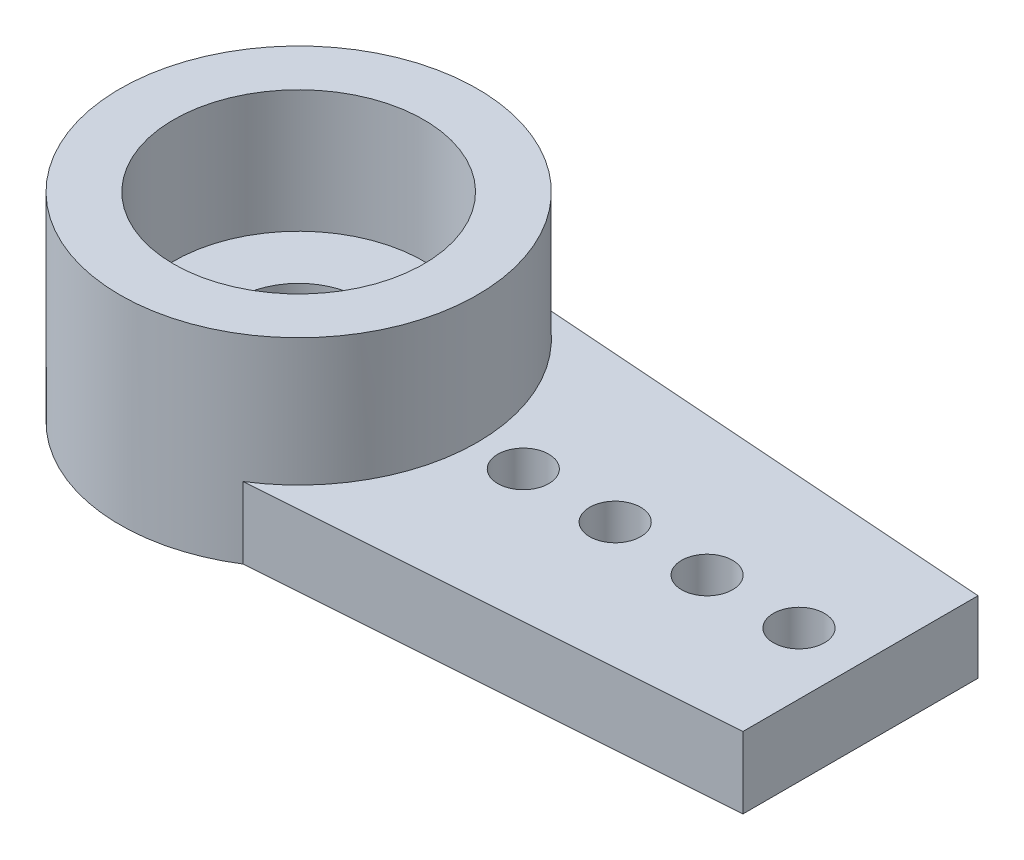
ISO-10303-21;
HEADER;
FILE_DESCRIPTION(('STEP AP214'),'2;1');
FILE_NAME('part.step','',(''),(''),'','','');
FILE_SCHEMA(('AUTOMOTIVE_DESIGN { 1 0 10303 214 1 1 1 1 }'));
ENDSEC;
DATA;
#1=APPLICATION_CONTEXT('core data for automotive mechanical design processes');
#2=APPLICATION_PROTOCOL_DEFINITION('international standard','automotive_design',2000,#1);
#3=PRODUCT_CONTEXT('',#1,'mechanical');
#4=PRODUCT('Part','Part','',(#3));
#5=PRODUCT_RELATED_PRODUCT_CATEGORY('part','',(#4));
#6=PRODUCT_DEFINITION_FORMATION('','',#4);
#7=PRODUCT_DEFINITION_CONTEXT('part definition',#1,'design');
#8=PRODUCT_DEFINITION('design','',#6,#7);
#9=PRODUCT_DEFINITION_SHAPE('','',#8);
#10=(LENGTH_UNIT() NAMED_UNIT(*) SI_UNIT(.MILLI.,.METRE.));
#11=(NAMED_UNIT(*) PLANE_ANGLE_UNIT() SI_UNIT($,.RADIAN.));
#12=(NAMED_UNIT(*) SI_UNIT($,.STERADIAN.) SOLID_ANGLE_UNIT());
#13=UNCERTAINTY_MEASURE_WITH_UNIT(LENGTH_MEASURE(1.E-05),#10,'distance_accuracy_value','');
#14=(GEOMETRIC_REPRESENTATION_CONTEXT(3) GLOBAL_UNCERTAINTY_ASSIGNED_CONTEXT((#13)) GLOBAL_UNIT_ASSIGNED_CONTEXT((#10,
#11,#12)) REPRESENTATION_CONTEXT('',''));
#15=CARTESIAN_POINT('',(0.,0.,0.));
#16=DIRECTION('',(0.,0.,1.));
#17=DIRECTION('',(1.,0.,0.));
#18=AXIS2_PLACEMENT_3D('',#15,#16,#17);
#19=CARTESIAN_POINT('',(-15.2,1.4,0.));
#20=DIRECTION('',(0.,1.,0.));
#21=DIRECTION('',(0.,0.,1.));
#22=AXIS2_PLACEMENT_3D('',#19,#20,#21);
#23=PLANE('',#22);
#24=CARTESIAN_POINT('',(6.2,1.4,0.));
#25=DIRECTION('',(0.,1.,0.));
#26=DIRECTION('',(0.,0.,1.));
#27=AXIS2_PLACEMENT_3D('',#24,#25,#26);
#28=CIRCLE('',#27,0.499999999999997);
#29=CARTESIAN_POINT('',(6.2,1.4,0.500000000000053));
#30=VERTEX_POINT('',#29);
#31=EDGE_CURVE('E129',#30,#30,#28,.T.);
#32=ORIENTED_EDGE('',*,*,#31,.F.);
#33=EDGE_LOOP('',(#32));
#34=FACE_BOUND('',#33,.T.);
#35=CARTESIAN_POINT('',(9.8,1.4,0.));
#36=DIRECTION('',(0.,1.,0.));
#37=DIRECTION('',(0.,0.,1.));
#38=AXIS2_PLACEMENT_3D('',#35,#36,#37);
#39=CIRCLE('',#38,0.499999999999997);
#40=CARTESIAN_POINT('',(9.8,1.4,0.500000000000028));
#41=VERTEX_POINT('',#40);
#42=EDGE_CURVE('E141',#41,#41,#39,.T.);
#43=ORIENTED_EDGE('',*,*,#42,.F.);
#44=EDGE_LOOP('',(#43));
#45=FACE_BOUND('',#44,.T.);
#46=CARTESIAN_POINT('',(8.,1.4,0.));
#47=DIRECTION('',(0.,1.,0.));
#48=DIRECTION('',(0.,0.,1.));
#49=AXIS2_PLACEMENT_3D('',#46,#47,#48);
#50=CIRCLE('',#49,0.499999999999997);
#51=CARTESIAN_POINT('',(8.,1.4,0.500000000000041));
#52=VERTEX_POINT('',#51);
#53=EDGE_CURVE('E135',#52,#52,#50,.T.);
#54=ORIENTED_EDGE('',*,*,#53,.F.);
#55=EDGE_LOOP('',(#54));
#56=FACE_BOUND('',#55,.T.);
#57=CARTESIAN_POINT('',(4.4,1.4,0.));
#58=DIRECTION('',(0.,1.,0.));
#59=DIRECTION('',(0.,0.,1.));
#60=AXIS2_PLACEMENT_3D('',#57,#58,#59);
#61=CIRCLE('',#60,0.499999999999997);
#62=CARTESIAN_POINT('',(4.4,1.4,0.500000000000066));
#63=VERTEX_POINT('',#62);
#64=EDGE_CURVE('E123',#63,#63,#61,.T.);
#65=ORIENTED_EDGE('',*,*,#64,.F.);
#66=EDGE_LOOP('',(#65));
#67=FACE_BOUND('',#66,.T.);
#68=CARTESIAN_POINT('',(0.,1.4,0.));
#69=DIRECTION('',(0.,1.,0.));
#70=DIRECTION('',(0.,0.,1.));
#71=AXIS2_PLACEMENT_3D('',#68,#69,#70);
#72=CIRCLE('',#71,3.5);
#73=CARTESIAN_POINT('',(1.86858471289894,1.4,2.95945791838985));
#74=VERTEX_POINT('',#73);
#75=CARTESIAN_POINT('',(1.86858471289894,1.4,-2.95945791838985));
#76=VERTEX_POINT('',#75);
#77=EDGE_CURVE('E87',#74,#76,#72,.T.);
#78=ORIENTED_EDGE('',*,*,#77,.F.);
#79=DIRECTION('',(0.997420198870011,0.,-0.0717840294641297));
#80=VECTOR('',#79,1.);
#81=CARTESIAN_POINT('',(-14.9001527327747,1.4,4.16629887091939));
#82=LINE('',#81,#80);
#83=CARTESIAN_POINT('',(11.0049169228788,1.4,2.30191885782311));
#84=VERTEX_POINT('',#83);
#85=EDGE_CURVE('E103',#74,#84,#82,.T.);
#86=ORIENTED_EDGE('',*,*,#85,.T.);
#87=DIRECTION('',(0.,0.,-1.));
#88=VECTOR('',#87,1.);
#89=CARTESIAN_POINT('',(11.0049169228788,1.4,-2.4767139860365));
#90=LINE('',#89,#88);
#91=CARTESIAN_POINT('',(11.0049169228788,1.4,-2.30191885782311));
#92=VERTEX_POINT('',#91);
#93=EDGE_CURVE('E41',#84,#92,#90,.T.);
#94=ORIENTED_EDGE('',*,*,#93,.T.);
#95=DIRECTION('',(-0.997420198870011,0.,-0.0717840294641295));
#96=VECTOR('',#95,1.);
#97=CARTESIAN_POINT('',(-14.9001527327747,1.4,-4.16629887091939));
#98=LINE('',#97,#96);
#99=EDGE_CURVE('E100',#92,#76,#98,.T.);
#100=ORIENTED_EDGE('',*,*,#99,.T.);
#101=EDGE_LOOP('',(#78,#86,#94,#100));
#102=FACE_BOUND('',#101,.T.);
#103=ADVANCED_FACE('F33',(#34,#45,#56,#67,#102),#23,.T.);
#104=CARTESIAN_POINT('',(-15.2,0.,0.));
#105=DIRECTION('',(0.,1.,0.));
#106=DIRECTION('',(0.,0.,1.));
#107=AXIS2_PLACEMENT_3D('',#104,#105,#106);
#108=PLANE('',#107);
#109=CARTESIAN_POINT('',(0.,0.,0.));
#110=DIRECTION('',(0.,-1.,0.));
#111=DIRECTION('',(0.,0.,-1.));
#112=AXIS2_PLACEMENT_3D('',#109,#110,#111);
#113=CIRCLE('',#112,2.35);
#114=CARTESIAN_POINT('',(0.,0.,-2.35));
#115=VERTEX_POINT('',#114);
#116=EDGE_CURVE('E115',#115,#115,#113,.T.);
#117=ORIENTED_EDGE('',*,*,#116,.F.);
#118=EDGE_LOOP('',(#117));
#119=FACE_BOUND('',#118,.T.);
#120=CARTESIAN_POINT('',(9.8,0.,0.));
#121=DIRECTION('',(0.,1.,0.));
#122=DIRECTION('',(0.,0.,1.));
#123=AXIS2_PLACEMENT_3D('',#120,#121,#122);
#124=CIRCLE('',#123,0.499999999999997);
#125=CARTESIAN_POINT('',(9.8,0.,0.500000000000028));
#126=VERTEX_POINT('',#125);
#127=EDGE_CURVE('E138',#126,#126,#124,.T.);
#128=ORIENTED_EDGE('',*,*,#127,.T.);
#129=EDGE_LOOP('',(#128));
#130=FACE_BOUND('',#129,.T.);
#131=CARTESIAN_POINT('',(8.,0.,0.));
#132=DIRECTION('',(0.,1.,0.));
#133=DIRECTION('',(0.,0.,1.));
#134=AXIS2_PLACEMENT_3D('',#131,#132,#133);
#135=CIRCLE('',#134,0.499999999999997);
#136=CARTESIAN_POINT('',(8.,0.,0.500000000000041));
#137=VERTEX_POINT('',#136);
#138=EDGE_CURVE('E132',#137,#137,#135,.T.);
#139=ORIENTED_EDGE('',*,*,#138,.T.);
#140=EDGE_LOOP('',(#139));
#141=FACE_BOUND('',#140,.T.);
#142=CARTESIAN_POINT('',(6.2,0.,0.));
#143=DIRECTION('',(0.,1.,0.));
#144=DIRECTION('',(0.,0.,1.));
#145=AXIS2_PLACEMENT_3D('',#142,#143,#144);
#146=CIRCLE('',#145,0.499999999999997);
#147=CARTESIAN_POINT('',(6.2,0.,0.500000000000053));
#148=VERTEX_POINT('',#147);
#149=EDGE_CURVE('E126',#148,#148,#146,.T.);
#150=ORIENTED_EDGE('',*,*,#149,.T.);
#151=EDGE_LOOP('',(#150));
#152=FACE_BOUND('',#151,.T.);
#153=CARTESIAN_POINT('',(4.4,0.,0.));
#154=DIRECTION('',(0.,1.,0.));
#155=DIRECTION('',(0.,0.,1.));
#156=AXIS2_PLACEMENT_3D('',#153,#154,#155);
#157=CIRCLE('',#156,0.499999999999997);
#158=CARTESIAN_POINT('',(4.4,0.,0.500000000000066));
#159=VERTEX_POINT('',#158);
#160=EDGE_CURVE('E120',#159,#159,#157,.T.);
#161=ORIENTED_EDGE('',*,*,#160,.T.);
#162=EDGE_LOOP('',(#161));
#163=FACE_BOUND('',#162,.T.);
#164=CARTESIAN_POINT('',(0.,0.,0.));
#165=DIRECTION('',(0.,-1.,0.));
#166=DIRECTION('',(0.,0.,-1.));
#167=AXIS2_PLACEMENT_3D('',#164,#165,#166);
#168=CIRCLE('',#167,3.5);
#169=CARTESIAN_POINT('',(1.86858471289894,0.,2.95945791838985));
#170=VERTEX_POINT('',#169);
#171=CARTESIAN_POINT('',(1.86858471289894,0.,-2.95945791838985));
#172=VERTEX_POINT('',#171);
#173=EDGE_CURVE('E72',#170,#172,#168,.T.);
#174=ORIENTED_EDGE('',*,*,#173,.T.);
#175=DIRECTION('',(0.997420198870011,0.,0.0717840294641295));
#176=VECTOR('',#175,1.);
#177=CARTESIAN_POINT('',(1.86858471289894,0.,-2.95945791838985));
#178=LINE('',#177,#176);
#179=CARTESIAN_POINT('',(11.0049169228788,0.,-2.30191885782311));
#180=VERTEX_POINT('',#179);
#181=EDGE_CURVE('E77',#172,#180,#178,.T.);
#182=ORIENTED_EDGE('',*,*,#181,.T.);
#183=DIRECTION('',(0.,0.,-1.));
#184=VECTOR('',#183,1.);
#185=CARTESIAN_POINT('',(11.0049169228788,0.,-2.4767139860365));
#186=LINE('',#185,#184);
#187=CARTESIAN_POINT('',(11.0049169228788,0.,2.30191885782311));
#188=VERTEX_POINT('',#187);
#189=EDGE_CURVE('E144',#188,#180,#186,.T.);
#190=ORIENTED_EDGE('',*,*,#189,.F.);
#191=DIRECTION('',(-0.997420198870011,0.,0.0717840294641296));
#192=VECTOR('',#191,1.);
#193=CARTESIAN_POINT('',(15.2,0.,2.));
#194=LINE('',#193,#192);
#195=EDGE_CURVE('E48',#188,#170,#194,.T.);
#196=ORIENTED_EDGE('',*,*,#195,.T.);
#197=EDGE_LOOP('',(#174,#182,#190,#196));
#198=FACE_BOUND('',#197,.T.);
#199=ADVANCED_FACE('F74',(#119,#130,#141,#152,#163,#198),#108,.F.);
#200=CARTESIAN_POINT('',(11.0049169228788,1.4,-2.4767139860365));
#201=DIRECTION('',(-1.,0.,0.));
#202=DIRECTION('',(0.,0.,1.));
#203=AXIS2_PLACEMENT_3D('',#200,#201,#202);
#204=PLANE('',#203);
#205=DIRECTION('',(0.,1.,0.));
#206=VECTOR('',#205,1.);
#207=CARTESIAN_POINT('',(11.0049169228788,1.4,2.30191885782311));
#208=LINE('',#207,#206);
#209=EDGE_CURVE('E52',#188,#84,#208,.T.);
#210=ORIENTED_EDGE('',*,*,#209,.F.);
#211=ORIENTED_EDGE('',*,*,#189,.T.);
#212=DIRECTION('',(0.,-1.,0.));
#213=VECTOR('',#212,1.);
#214=CARTESIAN_POINT('',(11.0049169228788,1.4,-2.30191885782311));
#215=LINE('',#214,#213);
#216=EDGE_CURVE('E94',#92,#180,#215,.T.);
#217=ORIENTED_EDGE('',*,*,#216,.F.);
#218=ORIENTED_EDGE('',*,*,#93,.F.);
#219=EDGE_LOOP('',(#210,#211,#217,#218));
#220=FACE_BOUND('',#219,.T.);
#221=ADVANCED_FACE('F35',(#220),#204,.F.);
#222=CARTESIAN_POINT('',(9.8,1.4,0.));
#223=DIRECTION('',(0.,-1.,0.));
#224=DIRECTION('',(0.,0.,-1.));
#225=AXIS2_PLACEMENT_3D('',#222,#223,#224);
#226=CYLINDRICAL_SURFACE('',#225,0.499999999999997);
#227=ORIENTED_EDGE('',*,*,#42,.T.);
#228=EDGE_LOOP('',(#227));
#229=FACE_BOUND('',#228,.T.);
#230=ORIENTED_EDGE('',*,*,#127,.F.);
#231=EDGE_LOOP('',(#230));
#232=FACE_BOUND('',#231,.T.);
#233=ADVANCED_FACE('F197',(#229,#232),#226,.F.);
#234=CARTESIAN_POINT('',(8.,1.4,0.));
#235=DIRECTION('',(0.,-1.,0.));
#236=DIRECTION('',(0.,0.,-1.));
#237=AXIS2_PLACEMENT_3D('',#234,#235,#236);
#238=CYLINDRICAL_SURFACE('',#237,0.499999999999997);
#239=ORIENTED_EDGE('',*,*,#53,.T.);
#240=EDGE_LOOP('',(#239));
#241=FACE_BOUND('',#240,.T.);
#242=ORIENTED_EDGE('',*,*,#138,.F.);
#243=EDGE_LOOP('',(#242));
#244=FACE_BOUND('',#243,.T.);
#245=ADVANCED_FACE('F186',(#241,#244),#238,.F.);
#246=CARTESIAN_POINT('',(6.2,1.4,0.));
#247=DIRECTION('',(0.,-1.,0.));
#248=DIRECTION('',(0.,0.,-1.));
#249=AXIS2_PLACEMENT_3D('',#246,#247,#248);
#250=CYLINDRICAL_SURFACE('',#249,0.499999999999997);
#251=ORIENTED_EDGE('',*,*,#31,.T.);
#252=EDGE_LOOP('',(#251));
#253=FACE_BOUND('',#252,.T.);
#254=ORIENTED_EDGE('',*,*,#149,.F.);
#255=EDGE_LOOP('',(#254));
#256=FACE_BOUND('',#255,.T.);
#257=ADVANCED_FACE('F180',(#253,#256),#250,.F.);
#258=CARTESIAN_POINT('',(4.4,1.4,0.));
#259=DIRECTION('',(0.,-1.,0.));
#260=DIRECTION('',(0.,0.,-1.));
#261=AXIS2_PLACEMENT_3D('',#258,#259,#260);
#262=CYLINDRICAL_SURFACE('',#261,0.499999999999997);
#263=ORIENTED_EDGE('',*,*,#64,.T.);
#264=EDGE_LOOP('',(#263));
#265=FACE_BOUND('',#264,.T.);
#266=ORIENTED_EDGE('',*,*,#160,.F.);
#267=EDGE_LOOP('',(#266));
#268=FACE_BOUND('',#267,.T.);
#269=ADVANCED_FACE('F165',(#265,#268),#262,.F.);
#270=CARTESIAN_POINT('',(0.,1.,0.));
#271=DIRECTION('',(0.,-1.,0.));
#272=DIRECTION('',(0.,0.,-1.));
#273=AXIS2_PLACEMENT_3D('',#270,#271,#272);
#274=CYLINDRICAL_SURFACE('',#273,2.35);
#275=CARTESIAN_POINT('',(0.,1.,0.));
#276=DIRECTION('',(0.,-1.,0.));
#277=DIRECTION('',(0.,0.,-1.));
#278=AXIS2_PLACEMENT_3D('',#275,#276,#277);
#279=CIRCLE('',#278,2.35);
#280=CARTESIAN_POINT('',(0.,1.,-2.35));
#281=VERTEX_POINT('',#280);
#282=EDGE_CURVE('E117',#281,#281,#279,.T.);
#283=ORIENTED_EDGE('',*,*,#282,.F.);
#284=EDGE_LOOP('',(#283));
#285=FACE_BOUND('',#284,.T.);
#286=ORIENTED_EDGE('',*,*,#116,.T.);
#287=EDGE_LOOP('',(#286));
#288=FACE_BOUND('',#287,.T.);
#289=ADVANCED_FACE('F159',(#285,#288),#274,.F.);
#290=CARTESIAN_POINT('',(0.,1.,0.));
#291=DIRECTION('',(0.,-1.,0.));
#292=DIRECTION('',(0.,0.,-1.));
#293=AXIS2_PLACEMENT_3D('',#290,#291,#292);
#294=PLANE('',#293);
#295=CARTESIAN_POINT('',(0.,1.,0.));
#296=DIRECTION('',(0.,-1.,0.));
#297=DIRECTION('',(0.,0.,-1.));
#298=AXIS2_PLACEMENT_3D('',#295,#296,#297);
#299=CIRCLE('',#298,1.2);
#300=CARTESIAN_POINT('',(0.,1.,-1.2));
#301=VERTEX_POINT('',#300);
#302=EDGE_CURVE('E108',#301,#301,#299,.T.);
#303=ORIENTED_EDGE('',*,*,#302,.F.);
#304=EDGE_LOOP('',(#303));
#305=FACE_BOUND('',#304,.T.);
#306=ORIENTED_EDGE('',*,*,#282,.T.);
#307=EDGE_LOOP('',(#306));
#308=FACE_BOUND('',#307,.T.);
#309=ADVANCED_FACE('F155',(#305,#308),#294,.T.);
#310=CARTESIAN_POINT('',(0.,3.9,0.));
#311=DIRECTION('',(0.,1.,0.));
#312=DIRECTION('',(0.,0.,1.));
#313=AXIS2_PLACEMENT_3D('',#310,#311,#312);
#314=PLANE('',#313);
#315=CARTESIAN_POINT('',(0.,3.9,0.));
#316=DIRECTION('',(0.,1.,0.));
#317=DIRECTION('',(0.,0.,1.));
#318=AXIS2_PLACEMENT_3D('',#315,#316,#317);
#319=CIRCLE('',#318,3.5);
#320=CARTESIAN_POINT('',(0.,3.9,3.5));
#321=VERTEX_POINT('',#320);
#322=EDGE_CURVE('E112',#321,#321,#319,.T.);
#323=ORIENTED_EDGE('',*,*,#322,.T.);
#324=EDGE_LOOP('',(#323));
#325=FACE_BOUND('',#324,.T.);
#326=CARTESIAN_POINT('',(0.,3.9,0.));
#327=DIRECTION('',(0.,1.,0.));
#328=DIRECTION('',(0.,0.,1.));
#329=AXIS2_PLACEMENT_3D('',#326,#327,#328);
#330=CIRCLE('',#329,2.45);
#331=CARTESIAN_POINT('',(0.,3.9,2.45));
#332=VERTEX_POINT('',#331);
#333=EDGE_CURVE('E109',#332,#332,#330,.T.);
#334=ORIENTED_EDGE('',*,*,#333,.F.);
#335=EDGE_LOOP('',(#334));
#336=FACE_BOUND('',#335,.T.);
#337=ADVANCED_FACE('F158',(#325,#336),#314,.T.);
#338=CARTESIAN_POINT('',(0.,3.9,0.));
#339=DIRECTION('',(0.,-1.,0.));
#340=DIRECTION('',(0.,0.,-1.));
#341=AXIS2_PLACEMENT_3D('',#338,#339,#340);
#342=CYLINDRICAL_SURFACE('',#341,3.5);
#343=DIRECTION('',(0.,-1.,0.));
#344=VECTOR('',#343,1.);
#345=CARTESIAN_POINT('',(1.86858471289894,3.9,-2.95945791838985));
#346=LINE('',#345,#344);
#347=EDGE_CURVE('E81',#76,#172,#346,.T.);
#348=ORIENTED_EDGE('',*,*,#347,.T.);
#349=ORIENTED_EDGE('',*,*,#173,.F.);
#350=DIRECTION('',(0.,-1.,0.));
#351=VECTOR('',#350,1.);
#352=CARTESIAN_POINT('',(1.86858471289894,3.9,2.95945791838985));
#353=LINE('',#352,#351);
#354=EDGE_CURVE('E90',#74,#170,#353,.T.);
#355=ORIENTED_EDGE('',*,*,#354,.F.);
#356=ORIENTED_EDGE('',*,*,#77,.T.);
#357=EDGE_LOOP('',(#348,#349,#355,#356));
#358=FACE_BOUND('',#357,.T.);
#359=ORIENTED_EDGE('',*,*,#322,.F.);
#360=EDGE_LOOP('',(#359));
#361=FACE_BOUND('',#360,.T.);
#362=ADVANCED_FACE('F84',(#358,#361),#342,.T.);
#363=CARTESIAN_POINT('',(0.,3.9,0.));
#364=DIRECTION('',(0.,-1.,0.));
#365=DIRECTION('',(0.,0.,-1.));
#366=AXIS2_PLACEMENT_3D('',#363,#364,#365);
#367=CYLINDRICAL_SURFACE('',#366,2.45);
#368=CARTESIAN_POINT('',(0.,1.5,0.));
#369=DIRECTION('',(0.,1.,0.));
#370=DIRECTION('',(0.,0.,1.));
#371=AXIS2_PLACEMENT_3D('',#368,#369,#370);
#372=CIRCLE('',#371,2.45);
#373=CARTESIAN_POINT('',(0.,1.5,2.45));
#374=VERTEX_POINT('',#373);
#375=EDGE_CURVE('E11',#374,#374,#372,.T.);
#376=ORIENTED_EDGE('',*,*,#375,.F.);
#377=EDGE_LOOP('',(#376));
#378=FACE_BOUND('',#377,.T.);
#379=ORIENTED_EDGE('',*,*,#333,.T.);
#380=EDGE_LOOP('',(#379));
#381=FACE_BOUND('',#380,.T.);
#382=ADVANCED_FACE('F256',(#378,#381),#367,.F.);
#383=CARTESIAN_POINT('',(0.,0.,0.));
#384=DIRECTION('',(0.,1.,0.));
#385=DIRECTION('',(0.,0.,1.));
#386=AXIS2_PLACEMENT_3D('',#383,#384,#385);
#387=CYLINDRICAL_SURFACE('',#386,1.2);
#388=ORIENTED_EDGE('',*,*,#302,.T.);
#389=EDGE_LOOP('',(#388));
#390=FACE_BOUND('',#389,.T.);
#391=CARTESIAN_POINT('',(0.,1.5,0.));
#392=DIRECTION('',(0.,1.,0.));
#393=DIRECTION('',(0.,0.,1.));
#394=AXIS2_PLACEMENT_3D('',#391,#392,#393);
#395=CIRCLE('',#394,1.2);
#396=CARTESIAN_POINT('',(0.,1.5,1.2));
#397=VERTEX_POINT('',#396);
#398=EDGE_CURVE('E105',#397,#397,#395,.T.);
#399=ORIENTED_EDGE('',*,*,#398,.T.);
#400=EDGE_LOOP('',(#399));
#401=FACE_BOUND('',#400,.T.);
#402=ADVANCED_FACE('F152',(#390,#401),#387,.F.);
#403=CARTESIAN_POINT('',(0.,1.5,0.));
#404=DIRECTION('',(0.,1.,0.));
#405=DIRECTION('',(0.,0.,1.));
#406=AXIS2_PLACEMENT_3D('',#403,#404,#405);
#407=PLANE('',#406);
#408=ORIENTED_EDGE('',*,*,#375,.T.);
#409=EDGE_LOOP('',(#408));
#410=FACE_BOUND('',#409,.T.);
#411=ORIENTED_EDGE('',*,*,#398,.F.);
#412=EDGE_LOOP('',(#411));
#413=FACE_BOUND('',#412,.T.);
#414=ADVANCED_FACE('F273',(#410,#413),#407,.T.);
#415=CARTESIAN_POINT('',(1.86858471289894,3.9,-2.95945791838985));
#416=DIRECTION('',(0.0717840294641295,0.,-0.997420198870011));
#417=DIRECTION('',(-0.997420198870011,0.,-0.0717840294641295));
#418=AXIS2_PLACEMENT_3D('',#415,#416,#417);
#419=PLANE('',#418);
#420=ORIENTED_EDGE('',*,*,#216,.T.);
#421=ORIENTED_EDGE('',*,*,#181,.F.);
#422=ORIENTED_EDGE('',*,*,#347,.F.);
#423=ORIENTED_EDGE('',*,*,#99,.F.);
#424=EDGE_LOOP('',(#420,#421,#422,#423));
#425=FACE_BOUND('',#424,.T.);
#426=ADVANCED_FACE('F92',(#425),#419,.T.);
#427=CARTESIAN_POINT('',(15.2,3.9,2.));
#428=DIRECTION('',(0.0717840294641297,0.,0.997420198870011));
#429=DIRECTION('',(0.997420198870011,0.,-0.0717840294641297));
#430=AXIS2_PLACEMENT_3D('',#427,#428,#429);
#431=PLANE('',#430);
#432=ORIENTED_EDGE('',*,*,#354,.T.);
#433=ORIENTED_EDGE('',*,*,#195,.F.);
#434=ORIENTED_EDGE('',*,*,#209,.T.);
#435=ORIENTED_EDGE('',*,*,#85,.F.);
#436=EDGE_LOOP('',(#432,#433,#434,#435));
#437=FACE_BOUND('',#436,.T.);
#438=ADVANCED_FACE('F311',(#437),#431,.T.);
#439=CLOSED_SHELL('',(#103,#199,#221,#233,#245,#257,#269,#289,#309,#337,#362,#382,#402,#414,
#426,#438));
#440=MANIFOLD_SOLID_BREP('B2',#439);
#441=ADVANCED_BREP_SHAPE_REPRESENTATION('',(#18,#440),#14);
#442=SHAPE_DEFINITION_REPRESENTATION(#9,#441);
ENDSEC;
END-ISO-10303-21;
